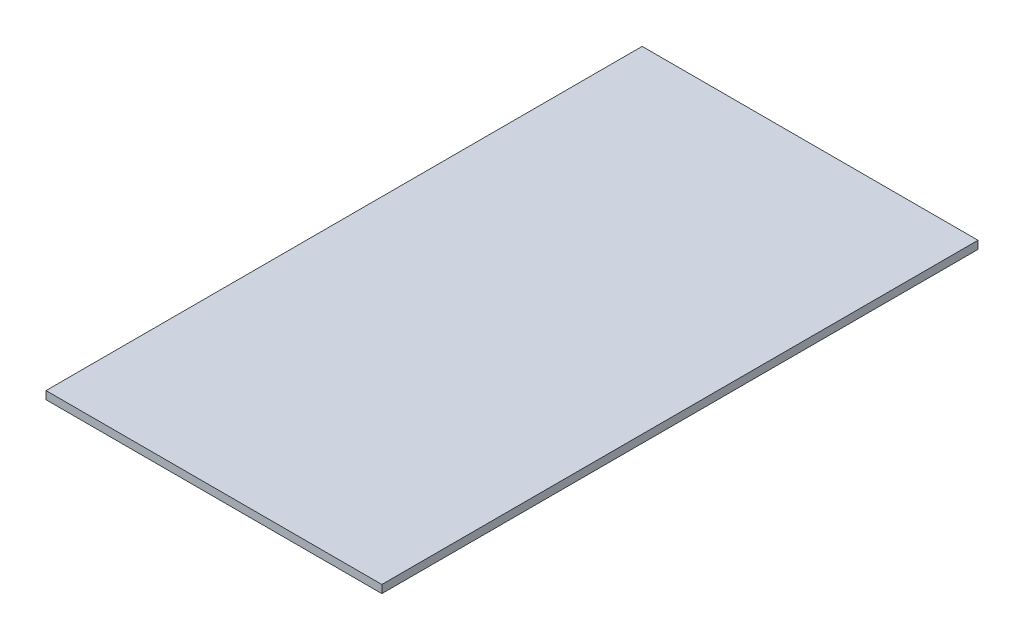
ISO-10303-21;
HEADER;
FILE_DESCRIPTION(('STEP AP214'),'2;1');
FILE_NAME('part.step','',(''),(''),'','','');
FILE_SCHEMA(('AUTOMOTIVE_DESIGN { 1 0 10303 214 1 1 1 1 }'));
ENDSEC;
DATA;
#1=APPLICATION_CONTEXT('core data for automotive mechanical design processes');
#2=APPLICATION_PROTOCOL_DEFINITION('international standard','automotive_design',2000,#1);
#3=PRODUCT_CONTEXT('',#1,'mechanical');
#4=PRODUCT('Part','Part','',(#3));
#5=PRODUCT_RELATED_PRODUCT_CATEGORY('part','',(#4));
#6=PRODUCT_DEFINITION_FORMATION('','',#4);
#7=PRODUCT_DEFINITION_CONTEXT('part definition',#1,'design');
#8=PRODUCT_DEFINITION('design','',#6,#7);
#9=PRODUCT_DEFINITION_SHAPE('','',#8);
#10=(LENGTH_UNIT() NAMED_UNIT(*) SI_UNIT(.MILLI.,.METRE.));
#11=(NAMED_UNIT(*) PLANE_ANGLE_UNIT() SI_UNIT($,.RADIAN.));
#12=(NAMED_UNIT(*) SI_UNIT($,.STERADIAN.) SOLID_ANGLE_UNIT());
#13=UNCERTAINTY_MEASURE_WITH_UNIT(LENGTH_MEASURE(1.E-05),#10,'distance_accuracy_value','');
#14=(GEOMETRIC_REPRESENTATION_CONTEXT(3) GLOBAL_UNCERTAINTY_ASSIGNED_CONTEXT((#13)) GLOBAL_UNIT_ASSIGNED_CONTEXT((#10,
#11,#12)) REPRESENTATION_CONTEXT('',''));
#15=CARTESIAN_POINT('',(0.,0.,0.));
#16=DIRECTION('',(0.,0.,1.));
#17=DIRECTION('',(1.,0.,0.));
#18=AXIS2_PLACEMENT_3D('',#15,#16,#17);
#19=CARTESIAN_POINT('',(0.,8.,0.));
#20=DIRECTION('',(1.,0.,0.));
#21=DIRECTION('',(0.,0.,-1.));
#22=AXIS2_PLACEMENT_3D('',#19,#20,#21);
#23=PLANE('',#22);
#24=DIRECTION('',(0.,0.,1.));
#25=VECTOR('',#24,1.);
#26=CARTESIAN_POINT('',(0.,0.,0.));
#27=LINE('',#26,#25);
#28=CARTESIAN_POINT('',(0.,0.,-600.));
#29=VERTEX_POINT('',#28);
#30=CARTESIAN_POINT('',(0.,0.,0.));
#31=VERTEX_POINT('',#30);
#32=EDGE_CURVE('E107',#29,#31,#27,.T.);
#33=ORIENTED_EDGE('',*,*,#32,.T.);
#34=DIRECTION('',(0.,-1.,0.));
#35=VECTOR('',#34,1.);
#36=CARTESIAN_POINT('',(0.,8.,0.));
#37=LINE('',#36,#35);
#38=CARTESIAN_POINT('',(0.,8.,0.));
#39=VERTEX_POINT('',#38);
#40=EDGE_CURVE('E11',#39,#31,#37,.T.);
#41=ORIENTED_EDGE('',*,*,#40,.F.);
#42=DIRECTION('',(0.,0.,1.));
#43=VECTOR('',#42,1.);
#44=CARTESIAN_POINT('',(0.,8.,0.));
#45=LINE('',#44,#43);
#46=CARTESIAN_POINT('',(0.,8.,-600.));
#47=VERTEX_POINT('',#46);
#48=EDGE_CURVE('E91',#47,#39,#45,.T.);
#49=ORIENTED_EDGE('',*,*,#48,.F.);
#50=DIRECTION('',(0.,-1.,0.));
#51=VECTOR('',#50,1.);
#52=CARTESIAN_POINT('',(0.,8.,-600.));
#53=LINE('',#52,#51);
#54=EDGE_CURVE('E103',#47,#29,#53,.T.);
#55=ORIENTED_EDGE('',*,*,#54,.T.);
#56=EDGE_LOOP('',(#33,#41,#49,#55));
#57=FACE_BOUND('',#56,.T.);
#58=ADVANCED_FACE('F39',(#57),#23,.F.);
#59=CARTESIAN_POINT('',(0.,8.,0.));
#60=DIRECTION('',(0.,0.,-1.));
#61=DIRECTION('',(-1.,0.,0.));
#62=AXIS2_PLACEMENT_3D('',#59,#60,#61);
#63=PLANE('',#62);
#64=DIRECTION('',(1.,0.,0.));
#65=VECTOR('',#64,1.);
#66=CARTESIAN_POINT('',(0.,0.,0.));
#67=LINE('',#66,#65);
#68=CARTESIAN_POINT('',(338.,0.,0.));
#69=VERTEX_POINT('',#68);
#70=EDGE_CURVE('E96',#31,#69,#67,.T.);
#71=ORIENTED_EDGE('',*,*,#70,.T.);
#72=DIRECTION('',(0.,-1.,0.));
#73=VECTOR('',#72,1.);
#74=CARTESIAN_POINT('',(338.,8.,0.));
#75=LINE('',#74,#73);
#76=CARTESIAN_POINT('',(338.,8.,0.));
#77=VERTEX_POINT('',#76);
#78=EDGE_CURVE('E48',#77,#69,#75,.T.);
#79=ORIENTED_EDGE('',*,*,#78,.F.);
#80=DIRECTION('',(1.,0.,0.));
#81=VECTOR('',#80,1.);
#82=CARTESIAN_POINT('',(0.,8.,0.));
#83=LINE('',#82,#81);
#84=EDGE_CURVE('E86',#39,#77,#83,.T.);
#85=ORIENTED_EDGE('',*,*,#84,.F.);
#86=ORIENTED_EDGE('',*,*,#40,.T.);
#87=EDGE_LOOP('',(#71,#79,#85,#86));
#88=FACE_BOUND('',#87,.T.);
#89=ADVANCED_FACE('F95',(#88),#63,.F.);
#90=CARTESIAN_POINT('',(338.,8.,0.));
#91=DIRECTION('',(-1.,0.,0.));
#92=DIRECTION('',(0.,0.,1.));
#93=AXIS2_PLACEMENT_3D('',#90,#91,#92);
#94=PLANE('',#93);
#95=DIRECTION('',(0.,0.,-1.));
#96=VECTOR('',#95,1.);
#97=CARTESIAN_POINT('',(338.,0.,0.));
#98=LINE('',#97,#96);
#99=CARTESIAN_POINT('',(338.,0.,-600.));
#100=VERTEX_POINT('',#99);
#101=EDGE_CURVE('E73',#69,#100,#98,.T.);
#102=ORIENTED_EDGE('',*,*,#101,.T.);
#103=DIRECTION('',(0.,-1.,0.));
#104=VECTOR('',#103,1.);
#105=CARTESIAN_POINT('',(338.,8.,-600.));
#106=LINE('',#105,#104);
#107=CARTESIAN_POINT('',(338.,8.,-600.));
#108=VERTEX_POINT('',#107);
#109=EDGE_CURVE('E98',#108,#100,#106,.T.);
#110=ORIENTED_EDGE('',*,*,#109,.F.);
#111=DIRECTION('',(0.,0.,-1.));
#112=VECTOR('',#111,1.);
#113=CARTESIAN_POINT('',(338.,8.,0.));
#114=LINE('',#113,#112);
#115=EDGE_CURVE('E89',#77,#108,#114,.T.);
#116=ORIENTED_EDGE('',*,*,#115,.F.);
#117=ORIENTED_EDGE('',*,*,#78,.T.);
#118=EDGE_LOOP('',(#102,#110,#116,#117));
#119=FACE_BOUND('',#118,.T.);
#120=ADVANCED_FACE('F99',(#119),#94,.F.);
#121=CARTESIAN_POINT('',(0.,8.,-600.));
#122=DIRECTION('',(0.,0.,1.));
#123=DIRECTION('',(1.,0.,0.));
#124=AXIS2_PLACEMENT_3D('',#121,#122,#123);
#125=PLANE('',#124);
#126=DIRECTION('',(-1.,0.,0.));
#127=VECTOR('',#126,1.);
#128=CARTESIAN_POINT('',(0.,0.,-600.));
#129=LINE('',#128,#127);
#130=EDGE_CURVE('E79',#100,#29,#129,.T.);
#131=ORIENTED_EDGE('',*,*,#130,.T.);
#132=ORIENTED_EDGE('',*,*,#54,.F.);
#133=DIRECTION('',(-1.,0.,0.));
#134=VECTOR('',#133,1.);
#135=CARTESIAN_POINT('',(0.,8.,-600.));
#136=LINE('',#135,#134);
#137=EDGE_CURVE('E56',#108,#47,#136,.T.);
#138=ORIENTED_EDGE('',*,*,#137,.F.);
#139=ORIENTED_EDGE('',*,*,#109,.T.);
#140=EDGE_LOOP('',(#131,#132,#138,#139));
#141=FACE_BOUND('',#140,.T.);
#142=ADVANCED_FACE('F120',(#141),#125,.F.);
#143=CARTESIAN_POINT('',(0.,8.,0.));
#144=DIRECTION('',(0.,-1.,0.));
#145=DIRECTION('',(0.,0.,-1.));
#146=AXIS2_PLACEMENT_3D('',#143,#144,#145);
#147=PLANE('',#146);
#148=ORIENTED_EDGE('',*,*,#48,.T.);
#149=ORIENTED_EDGE('',*,*,#84,.T.);
#150=ORIENTED_EDGE('',*,*,#115,.T.);
#151=ORIENTED_EDGE('',*,*,#137,.T.);
#152=EDGE_LOOP('',(#148,#149,#150,#151));
#153=FACE_BOUND('',#152,.T.);
#154=ADVANCED_FACE('F87',(#153),#147,.F.);
#155=CARTESIAN_POINT('',(0.,0.,0.));
#156=DIRECTION('',(0.,-1.,0.));
#157=DIRECTION('',(0.,0.,-1.));
#158=AXIS2_PLACEMENT_3D('',#155,#156,#157);
#159=PLANE('',#158);
#160=ORIENTED_EDGE('',*,*,#32,.F.);
#161=ORIENTED_EDGE('',*,*,#130,.F.);
#162=ORIENTED_EDGE('',*,*,#101,.F.);
#163=ORIENTED_EDGE('',*,*,#70,.F.);
#164=EDGE_LOOP('',(#160,#161,#162,#163));
#165=FACE_BOUND('',#164,.T.);
#166=ADVANCED_FACE('F123',(#165),#159,.T.);
#167=CLOSED_SHELL('',(#58,#89,#120,#142,#154,#166));
#168=MANIFOLD_SOLID_BREP('B2',#167);
#169=ADVANCED_BREP_SHAPE_REPRESENTATION('',(#18,#168),#14);
#170=SHAPE_DEFINITION_REPRESENTATION(#9,#169);
ENDSEC;
END-ISO-10303-21;
